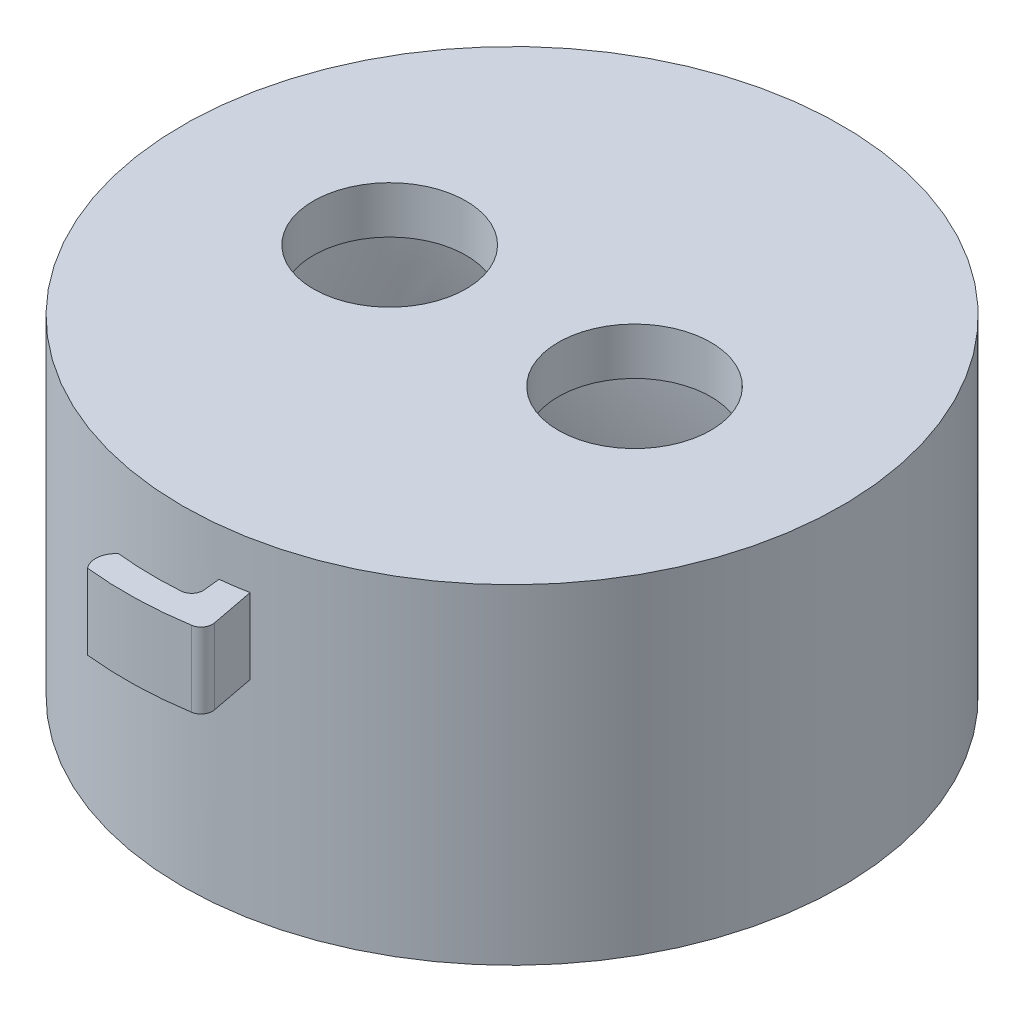
ISO-10303-21;
HEADER;
FILE_DESCRIPTION(('STEP AP214'),'2;1');
FILE_NAME('part.step','',(''),(''),'','','');
FILE_SCHEMA(('AUTOMOTIVE_DESIGN { 1 0 10303 214 1 1 1 1 }'));
ENDSEC;
DATA;
#1=APPLICATION_CONTEXT('core data for automotive mechanical design processes');
#2=APPLICATION_PROTOCOL_DEFINITION('international standard','automotive_design',2000,#1);
#3=PRODUCT_CONTEXT('',#1,'mechanical');
#4=PRODUCT('Part','Part','',(#3));
#5=PRODUCT_RELATED_PRODUCT_CATEGORY('part','',(#4));
#6=PRODUCT_DEFINITION_FORMATION('','',#4);
#7=PRODUCT_DEFINITION_CONTEXT('part definition',#1,'design');
#8=PRODUCT_DEFINITION('design','',#6,#7);
#9=PRODUCT_DEFINITION_SHAPE('','',#8);
#10=(LENGTH_UNIT() NAMED_UNIT(*) SI_UNIT(.MILLI.,.METRE.));
#11=(NAMED_UNIT(*) PLANE_ANGLE_UNIT() SI_UNIT($,.RADIAN.));
#12=(NAMED_UNIT(*) SI_UNIT($,.STERADIAN.) SOLID_ANGLE_UNIT());
#13=UNCERTAINTY_MEASURE_WITH_UNIT(LENGTH_MEASURE(1.E-05),#10,'distance_accuracy_value','');
#14=(GEOMETRIC_REPRESENTATION_CONTEXT(3) GLOBAL_UNCERTAINTY_ASSIGNED_CONTEXT((#13)) GLOBAL_UNIT_ASSIGNED_CONTEXT((#10,
#11,#12)) REPRESENTATION_CONTEXT('',''));
#15=CARTESIAN_POINT('',(0.,0.,0.));
#16=DIRECTION('',(0.,0.,1.));
#17=DIRECTION('',(1.,0.,0.));
#18=AXIS2_PLACEMENT_3D('',#15,#16,#17);
#19=CARTESIAN_POINT('',(0.,17.5,0.));
#20=DIRECTION('',(0.,-1.,0.));
#21=DIRECTION('',(0.,0.,-1.));
#22=AXIS2_PLACEMENT_3D('',#19,#20,#21);
#23=CYLINDRICAL_SURFACE('',#22,35.);
#24=CARTESIAN_POINT('',(0.,-17.5,0.));
#25=DIRECTION('',(0.,1.,0.));
#26=DIRECTION('',(0.,0.,1.));
#27=AXIS2_PLACEMENT_3D('',#24,#25,#26);
#28=CIRCLE('',#27,35.);
#29=CARTESIAN_POINT('',(0.,-17.5,35.));
#30=VERTEX_POINT('',#29);
#31=EDGE_CURVE('E46',#30,#30,#28,.T.);
#32=ORIENTED_EDGE('',*,*,#31,.T.);
#33=EDGE_LOOP('',(#32));
#34=FACE_BOUND('',#33,.T.);
#35=CARTESIAN_POINT('',(0.,17.5,0.));
#36=DIRECTION('',(0.,1.,0.));
#37=DIRECTION('',(0.,0.,1.));
#38=AXIS2_PLACEMENT_3D('',#35,#36,#37);
#39=CIRCLE('',#38,35.);
#40=CARTESIAN_POINT('',(0.,17.5,35.));
#41=VERTEX_POINT('',#40);
#42=EDGE_CURVE('E12',#41,#41,#39,.T.);
#43=ORIENTED_EDGE('',*,*,#42,.F.);
#44=EDGE_LOOP('',(#43));
#45=FACE_BOUND('',#44,.T.);
#46=CARTESIAN_POINT('',(0.,4.5,0.));
#47=DIRECTION('',(0.,1.,0.));
#48=DIRECTION('',(0.,0.,1.));
#49=AXIS2_PLACEMENT_3D('',#46,#47,#48);
#50=CIRCLE('',#49,35.);
#51=CARTESIAN_POINT('',(3.68421052631579,4.5,34.8055540510101));
#52=VERTEX_POINT('',#51);
#53=CARTESIAN_POINT('',(6.5596919127086,4.5,34.3797970036233));
#54=VERTEX_POINT('',#53);
#55=EDGE_CURVE('E114',#52,#54,#50,.T.);
#56=ORIENTED_EDGE('',*,*,#55,.F.);
#57=DIRECTION('',(0.,1.,0.));
#58=VECTOR('',#57,1.);
#59=CARTESIAN_POINT('',(3.68421052631579,4.5,34.8055540510101));
#60=LINE('',#59,#58);
#61=CARTESIAN_POINT('',(3.68421052631579,12.5,34.8055540510101));
#62=VERTEX_POINT('',#61);
#63=EDGE_CURVE('E132',#52,#62,#60,.T.);
#64=ORIENTED_EDGE('',*,*,#63,.T.);
#65=CARTESIAN_POINT('',(0.,12.5,0.));
#66=DIRECTION('',(0.,1.,0.));
#67=DIRECTION('',(0.,0.,1.));
#68=AXIS2_PLACEMENT_3D('',#65,#66,#67);
#69=CIRCLE('',#68,35.);
#70=CARTESIAN_POINT('',(6.5596919127086,12.5,34.3797970036233));
#71=VERTEX_POINT('',#70);
#72=EDGE_CURVE('E131',#62,#71,#69,.T.);
#73=ORIENTED_EDGE('',*,*,#72,.T.);
#74=DIRECTION('',(0.,1.,0.));
#75=VECTOR('',#74,1.);
#76=CARTESIAN_POINT('',(6.5596919127086,4.5,34.3797970036233));
#77=LINE('',#76,#75);
#78=EDGE_CURVE('E126',#54,#71,#77,.T.);
#79=ORIENTED_EDGE('',*,*,#78,.F.);
#80=EDGE_LOOP('',(#56,#64,#73,#79));
#81=FACE_BOUND('',#80,.T.);
#82=ADVANCED_FACE('F38',(#34,#45,#81),#23,.T.);
#83=CARTESIAN_POINT('',(0.,17.5,0.));
#84=DIRECTION('',(0.,1.,0.));
#85=DIRECTION('',(0.,0.,1.));
#86=AXIS2_PLACEMENT_3D('',#83,#84,#85);
#87=PLANE('',#86);
#88=CARTESIAN_POINT('',(-13.,17.5,0.));
#89=DIRECTION('',(0.,1.,0.));
#90=DIRECTION('',(0.,0.,1.));
#91=AXIS2_PLACEMENT_3D('',#88,#89,#90);
#92=CIRCLE('',#91,8.1);
#93=CARTESIAN_POINT('',(-13.,17.5,8.1));
#94=VERTEX_POINT('',#93);
#95=EDGE_CURVE('E201',#94,#94,#92,.T.);
#96=ORIENTED_EDGE('',*,*,#95,.F.);
#97=EDGE_LOOP('',(#96));
#98=FACE_BOUND('',#97,.T.);
#99=CARTESIAN_POINT('',(13.,17.5,0.));
#100=DIRECTION('',(0.,1.,0.));
#101=DIRECTION('',(0.,0.,1.));
#102=AXIS2_PLACEMENT_3D('',#99,#100,#101);
#103=CIRCLE('',#102,8.1);
#104=CARTESIAN_POINT('',(13.,17.5,8.1));
#105=VERTEX_POINT('',#104);
#106=EDGE_CURVE('E200',#105,#105,#103,.T.);
#107=ORIENTED_EDGE('',*,*,#106,.F.);
#108=EDGE_LOOP('',(#107));
#109=FACE_BOUND('',#108,.T.);
#110=ORIENTED_EDGE('',*,*,#42,.T.);
#111=EDGE_LOOP('',(#110));
#112=FACE_BOUND('',#111,.T.);
#113=ADVANCED_FACE('F213',(#98,#109,#112),#87,.T.);
#114=CARTESIAN_POINT('',(0.,-17.5,0.));
#115=DIRECTION('',(0.,1.,0.));
#116=DIRECTION('',(0.,0.,1.));
#117=AXIS2_PLACEMENT_3D('',#114,#115,#116);
#118=PLANE('',#117);
#119=CARTESIAN_POINT('',(0.,-17.5,0.));
#120=DIRECTION('',(0.,-1.,0.));
#121=DIRECTION('',(0.,0.,-1.));
#122=AXIS2_PLACEMENT_3D('',#119,#120,#121);
#123=CIRCLE('',#122,30.25);
#124=CARTESIAN_POINT('',(-27.910850381071,-17.5,11.6639157663912));
#125=VERTEX_POINT('',#124);
#126=EDGE_CURVE('E156',#125,#125,#123,.T.);
#127=ORIENTED_EDGE('',*,*,#126,.F.);
#128=EDGE_LOOP('',(#127));
#129=FACE_BOUND('',#128,.T.);
#130=ORIENTED_EDGE('',*,*,#31,.F.);
#131=EDGE_LOOP('',(#130));
#132=FACE_BOUND('',#131,.T.);
#133=ADVANCED_FACE('F210',(#129,#132),#118,.F.);
#134=CARTESIAN_POINT('',(13.,-17.5,0.));
#135=DIRECTION('',(0.,1.,0.));
#136=DIRECTION('',(0.,0.,1.));
#137=AXIS2_PLACEMENT_3D('',#134,#135,#136);
#138=CYLINDRICAL_SURFACE('',#137,8.1);
#139=CARTESIAN_POINT('',(13.,12.5,0.));
#140=DIRECTION('',(0.,1.,0.));
#141=DIRECTION('',(0.,0.,1.));
#142=AXIS2_PLACEMENT_3D('',#139,#140,#141);
#143=CIRCLE('',#142,8.1);
#144=CARTESIAN_POINT('',(13.,12.5,8.1));
#145=VERTEX_POINT('',#144);
#146=EDGE_CURVE('E197',#145,#145,#143,.F.);
#147=ORIENTED_EDGE('',*,*,#146,.T.);
#148=EDGE_LOOP('',(#147));
#149=FACE_BOUND('',#148,.T.);
#150=ORIENTED_EDGE('',*,*,#106,.T.);
#151=EDGE_LOOP('',(#150));
#152=FACE_BOUND('',#151,.T.);
#153=ADVANCED_FACE('F212',(#149,#152),#138,.F.);
#154=CARTESIAN_POINT('',(-13.,-17.5,0.));
#155=DIRECTION('',(0.,1.,0.));
#156=DIRECTION('',(0.,0.,1.));
#157=AXIS2_PLACEMENT_3D('',#154,#155,#156);
#158=CYLINDRICAL_SURFACE('',#157,8.1);
#159=CARTESIAN_POINT('',(-13.,12.5,0.));
#160=DIRECTION('',(0.,1.,0.));
#161=DIRECTION('',(0.,0.,1.));
#162=AXIS2_PLACEMENT_3D('',#159,#160,#161);
#163=CIRCLE('',#162,8.1);
#164=CARTESIAN_POINT('',(-13.,12.5,8.1));
#165=VERTEX_POINT('',#164);
#166=EDGE_CURVE('E41',#165,#165,#163,.F.);
#167=ORIENTED_EDGE('',*,*,#166,.T.);
#168=EDGE_LOOP('',(#167));
#169=FACE_BOUND('',#168,.T.);
#170=ORIENTED_EDGE('',*,*,#95,.T.);
#171=EDGE_LOOP('',(#170));
#172=FACE_BOUND('',#171,.T.);
#173=ADVANCED_FACE('F182',(#169,#172),#158,.F.);
#174=CARTESIAN_POINT('',(0.,12.5,0.));
#175=DIRECTION('',(0.,1.,0.));
#176=DIRECTION('',(0.,0.,1.));
#177=AXIS2_PLACEMENT_3D('',#174,#175,#176);
#178=PLANE('',#177);
#179=ORIENTED_EDGE('',*,*,#166,.F.);
#180=EDGE_LOOP('',(#179));
#181=FACE_BOUND('',#180,.T.);
#182=CARTESIAN_POINT('',(0.,12.5,0.));
#183=DIRECTION('',(0.,1.,0.));
#184=DIRECTION('',(0.,0.,1.));
#185=AXIS2_PLACEMENT_3D('',#182,#183,#184);
#186=CIRCLE('',#185,29.5);
#187=CARTESIAN_POINT('',(-29.1483123128359,12.5,-4.54157344027123));
#188=VERTEX_POINT('',#187);
#189=EDGE_CURVE('E151',#188,#188,#186,.T.);
#190=ORIENTED_EDGE('',*,*,#189,.F.);
#191=EDGE_LOOP('',(#190));
#192=FACE_BOUND('',#191,.T.);
#193=ORIENTED_EDGE('',*,*,#146,.F.);
#194=EDGE_LOOP('',(#193));
#195=FACE_BOUND('',#194,.T.);
#196=ADVANCED_FACE('F171',(#181,#192,#195),#178,.F.);
#197=CARTESIAN_POINT('',(-27.910850381071,-17.5,11.6639157663912));
#198=CARTESIAN_POINT('',(-29.1483123128359,12.5,-4.54157344027123));
#199=CARTESIAN_POINT('',(-4.58301884828858,-17.5,67.4856165285332));
#200=CARTESIAN_POINT('',(-38.2314591933784,12.5,53.7550511854007));
#201=CARTESIAN_POINT('',(51.2386819138534,-17.5,44.1577849957508));
#202=CARTESIAN_POINT('',(20.0651654322935,12.5,62.8381980659431));
#203=CARTESIAN_POINT('',(27.910850381071,-17.5,-11.6639157663912));
#204=CARTESIAN_POINT('',(29.1483123128359,12.5,4.5415734402712));
#205=CARTESIAN_POINT('',(4.58301884828856,-17.5,-67.4856165285332));
#206=CARTESIAN_POINT('',(38.2314591933783,12.5,-53.7550511854007));
#207=CARTESIAN_POINT('',(-51.2386819138535,-17.5,-44.1577849957508));
#208=CARTESIAN_POINT('',(-20.0651654322935,12.5,-62.8381980659431));
#209=CARTESIAN_POINT('',(-27.910850381071,-17.5,11.6639157663912));
#210=CARTESIAN_POINT('',(-29.1483123128359,12.5,-4.54157344027123));
#211=(BOUNDED_SURFACE() B_SPLINE_SURFACE(3,1,((#197,#198),(#199,#200),(#201,#202),(#203,#204),
(#205,#206),(#207,#208),(#209,#210)),.UNSPECIFIED.,.T.,.F.,.F.) B_SPLINE_SURFACE_WITH_KNOTS((4,
3,4),(2,2),(0.,0.5,1.),(0.,1.),
.UNSPECIFIED.) GEOMETRIC_REPRESENTATION_ITEM() RATIONAL_B_SPLINE_SURFACE(((1.,1.),
(0.333333333333333,0.333333333333333),(0.333333333333333,0.333333333333333),(1.,1.),
(0.333333333333333,0.333333333333333),(0.333333333333333,0.333333333333333),(1.,1.))) REPRESENTATION_ITEM('') SURFACE());
#212=CARTESIAN_POINT('',(-27.910850381071,-17.5,11.6639157663912));
#213=CARTESIAN_POINT('',(-27.9237406095269,-17.1875,11.4951085871551));
#214=CARTESIAN_POINT('',(-27.9366308379828,-16.875,11.3263014079191));
#215=CARTESIAN_POINT('',(-27.9624112948945,-16.25,10.9886870494469));
#216=CARTESIAN_POINT('',(-27.9753015233504,-15.9375,10.8198798702109));
#217=CARTESIAN_POINT('',(-28.0010819802622,-15.3125,10.4822655117387));
#218=CARTESIAN_POINT('',(-28.0139722087181,-15.,10.3134583325027));
#219=CARTESIAN_POINT('',(-28.0397526656298,-14.375,9.97584397403054));
#220=CARTESIAN_POINT('',(-28.0526428940857,-14.0625,9.80703679479447));
#221=CARTESIAN_POINT('',(-28.0784233509975,-13.4375,9.46942243632234));
#222=CARTESIAN_POINT('',(-28.0913135794534,-13.125,9.30061525708627));
#223=CARTESIAN_POINT('',(-28.1170940363651,-12.5,8.96300089861414));
#224=CARTESIAN_POINT('',(-28.129984264821,-12.1875,8.79419371937807));
#225=CARTESIAN_POINT('',(-28.1557647217328,-11.5625,8.45657936090593));
#226=CARTESIAN_POINT('',(-28.1686549501887,-11.25,8.28777218166987));
#227=CARTESIAN_POINT('',(-28.1944354071005,-10.625,7.95015782319773));
#228=CARTESIAN_POINT('',(-28.2073256355563,-10.3125,7.78135064396166));
#229=CARTESIAN_POINT('',(-28.2331060924681,-9.6875,7.44373628548953));
#230=CARTESIAN_POINT('',(-28.245996320924,-9.375,7.27492910625346));
#231=CARTESIAN_POINT('',(-28.2717767778358,-8.75,6.93731474778133));
#232=CARTESIAN_POINT('',(-28.2846670062917,-8.4375,6.76850756854526));
#233=CARTESIAN_POINT('',(-28.3104474632034,-7.8125,6.43089321007313));
#234=CARTESIAN_POINT('',(-28.3233376916593,-7.5,6.26208603083706));
#235=CARTESIAN_POINT('',(-28.3491181485711,-6.875,5.92447167236493));
#236=CARTESIAN_POINT('',(-28.362008377027,-6.5625,5.75566449312886));
#237=CARTESIAN_POINT('',(-28.3877888339387,-5.9375,5.41805013465673));
#238=CARTESIAN_POINT('',(-28.4006790623946,-5.625,5.24924295542066));
#239=CARTESIAN_POINT('',(-28.4264595193064,-5.,4.91162859694852));
#240=CARTESIAN_POINT('',(-28.4393497477623,-4.6875,4.74282141771246));
#241=CARTESIAN_POINT('',(-28.465130204674,-4.0625,4.40520705924032));
#242=CARTESIAN_POINT('',(-28.4780204331299,-3.75,4.23639988000426));
#243=CARTESIAN_POINT('',(-28.5038008900417,-3.125,3.89878552153212));
#244=CARTESIAN_POINT('',(-28.5166911184976,-2.8125,3.72997834229605));
#245=CARTESIAN_POINT('',(-28.5424715754093,-2.1875,3.39236398382392));
#246=CARTESIAN_POINT('',(-28.5553618038652,-1.875,3.22355680458785));
#247=CARTESIAN_POINT('',(-28.581142260777,-1.25,2.88594244611572));
#248=CARTESIAN_POINT('',(-28.5940324892329,-0.9375,2.71713526687965));
#249=CARTESIAN_POINT('',(-28.6198129461447,-0.312500000000001,2.37952090840752));
#250=CARTESIAN_POINT('',(-28.6327031746005,0.,2.21071372917145));
#251=CARTESIAN_POINT('',(-28.6584836315123,0.624999999999999,1.87309937069932));
#252=CARTESIAN_POINT('',(-28.6713738599682,0.937499999999999,1.70429219146325));
#253=CARTESIAN_POINT('',(-28.69715431688,1.5625,1.36667783299112));
#254=CARTESIAN_POINT('',(-28.7100445453359,1.875,1.19787065375505));
#255=CARTESIAN_POINT('',(-28.7358250022476,2.5,0.860256295282915));
#256=CARTESIAN_POINT('',(-28.7487152307035,2.8125,0.691449116046848));
#257=CARTESIAN_POINT('',(-28.7744956876153,3.4375,0.353834757574714));
#258=CARTESIAN_POINT('',(-28.7873859160712,3.75,0.185027578338647));
#259=CARTESIAN_POINT('',(-28.8131663729829,4.375,-0.152586780133488));
#260=CARTESIAN_POINT('',(-28.8260566014388,4.6875,-0.321393959369555));
#261=CARTESIAN_POINT('',(-28.8518370583506,5.3125,-0.659008317841689));
#262=CARTESIAN_POINT('',(-28.8647272868065,5.625,-0.827815497077756));
#263=CARTESIAN_POINT('',(-28.8905077437182,6.25,-1.16542985554989));
#264=CARTESIAN_POINT('',(-28.9033979721741,6.5625,-1.33423703478596));
#265=CARTESIAN_POINT('',(-28.9291784290859,7.1875,-1.67185139325809));
#266=CARTESIAN_POINT('',(-28.9420686575418,7.5,-1.84065857249416));
#267=CARTESIAN_POINT('',(-28.9678491144535,8.125,-2.17827293096629));
#268=CARTESIAN_POINT('',(-28.9807393429094,8.4375,-2.34708011020236));
#269=CARTESIAN_POINT('',(-29.0065197998212,9.0625,-2.68469446867449));
#270=CARTESIAN_POINT('',(-29.0194100282771,9.375,-2.85350164791056));
#271=CARTESIAN_POINT('',(-29.0451904851889,10.,-3.1911160063827));
#272=CARTESIAN_POINT('',(-29.0580807136447,10.3125,-3.35992318561876));
#273=CARTESIAN_POINT('',(-29.0838611705565,10.9375,-3.6975375440909));
#274=CARTESIAN_POINT('',(-29.0967513990124,11.25,-3.86634472332696));
#275=CARTESIAN_POINT('',(-29.1225318559242,11.875,-4.2039590817991));
#276=CARTESIAN_POINT('',(-29.13542208438,12.1875,-4.37276626103517));
#277=CARTESIAN_POINT('',(-29.1483123128359,12.5,-4.54157344027123));
#278=B_SPLINE_CURVE_WITH_KNOTS('',3,(#212,#213,#214,#215,#216,#217,#218,#219,#220,#221,#222,
#223,#224,#225,#226,#227,#228,#229,#230,#231,#232,#233,#234,#235,#236,#237,#238,#239,#240,#241,
#242,#243,#244,#245,#246,#247,#248,#249,#250,#251,#252,#253,#254,#255,#256,#257,#258,#259,#260,
#261,#262,#263,#264,#265,#266,#267,#268,#269,#270,#271,#272,#273,#274,#275,#276,#277),
.UNSPECIFIED.,.F.,.F.,(4,2,2,2,2,2,2,2,2,2,2,2,2,2,2,2,2,2,2,2,2,2,2,2,2,2,2,2,2,2,2,2,4),(0.,
1.06623845633214,2.13247691266428,3.19871536899642,4.26495382532856,5.3311922816607,
6.39743073799283,7.46366919432498,8.52990765065712,9.59614610698925,10.6623845633214,
11.7286230196535,12.7948614759857,13.8610999323178,14.9273383886499,15.9935768449821,
17.0598153013142,18.1260537576464,19.1922922139785,20.2585306703106,21.3247691266428,
22.3910075829749,23.4572460393071,24.5234844956392,25.5897229519713,26.6559614083035,
27.7221998646356,28.7884383209678,29.8546767772999,30.920915233632,31.9871536899642,
33.0533921462963,34.1196306026285),.UNSPECIFIED.);
#279=EDGE_CURVE('BSEAM158',#125,#188,#278,.T.);
#280=ORIENTED_EDGE('',*,*,#126,.T.);
#281=ORIENTED_EDGE('',*,*,#189,.T.);
#282=ORIENTED_EDGE('',*,*,#279,.T.);
#283=ORIENTED_EDGE('',*,*,#279,.F.);
#284=EDGE_LOOP('',(#280,#282,#281,#283));
#285=FACE_BOUND('',#284,.T.);
#286=ADVANCED_FACE('F158',(#285),#211,.F.);
#287=CARTESIAN_POINT('',(2.67829088443903,4.5,36.7024080672962));
#288=DIRECTION('',(0.,1.,0.));
#289=DIRECTION('',(0.,0.,1.));
#290=AXIS2_PLACEMENT_3D('',#287,#288,#289);
#291=CYLINDRICAL_SURFACE('',#290,1.2);
#292=CARTESIAN_POINT('',(2.67829088443903,12.5,36.7024080672962));
#293=DIRECTION('',(0.,1.,0.));
#294=DIRECTION('',(0.,0.,1.));
#295=AXIS2_PLACEMENT_3D('',#292,#293,#294);
#296=CIRCLE('',#295,1.2);
#297=CARTESIAN_POINT('',(2.7656264567577,12.5,37.8992257216646));
#298=VERTEX_POINT('',#297);
#299=CARTESIAN_POINT('',(3.87162416618795,12.5,36.5760922778225));
#300=VERTEX_POINT('',#299);
#301=EDGE_CURVE('E348',#298,#300,#296,.T.);
#302=ORIENTED_EDGE('',*,*,#301,.T.);
#303=DIRECTION('',(0.,1.,0.));
#304=VECTOR('',#303,1.);
#305=CARTESIAN_POINT('',(3.87162416618795,4.5,36.5760922778225));
#306=LINE('',#305,#304);
#307=CARTESIAN_POINT('',(3.87162416618795,4.5,36.5760922778225));
#308=VERTEX_POINT('',#307);
#309=EDGE_CURVE('E134',#308,#300,#306,.T.);
#310=ORIENTED_EDGE('',*,*,#309,.F.);
#311=CARTESIAN_POINT('',(2.67829088443903,4.5,36.7024080672962));
#312=DIRECTION('',(0.,1.,0.));
#313=DIRECTION('',(0.,0.,1.));
#314=AXIS2_PLACEMENT_3D('',#311,#312,#313);
#315=CIRCLE('',#314,1.2);
#316=CARTESIAN_POINT('',(2.7656264567577,4.5,37.8992257216646));
#317=VERTEX_POINT('',#316);
#318=EDGE_CURVE('E366',#317,#308,#315,.T.);
#319=ORIENTED_EDGE('',*,*,#318,.F.);
#320=DIRECTION('',(0.,1.,0.));
#321=VECTOR('',#320,1.);
#322=CARTESIAN_POINT('',(2.7656264567577,4.5,37.8992257216646));
#323=LINE('',#322,#321);
#324=EDGE_CURVE('E97',#317,#298,#323,.T.);
#325=ORIENTED_EDGE('',*,*,#324,.T.);
#326=EDGE_LOOP('',(#302,#310,#319,#325));
#327=FACE_BOUND('',#326,.T.);
#328=ADVANCED_FACE('F170',(#327),#291,.F.);
#329=CARTESIAN_POINT('',(0.,4.5,0.));
#330=DIRECTION('',(0.994444401457431,0.,-0.105263157894737));
#331=DIRECTION('',(-0.105263157894737,0.,-0.994444401457431));
#332=AXIS2_PLACEMENT_3D('',#329,#330,#331);
#333=PLANE('',#332);
#334=DIRECTION('',(-0.105263157894737,0.,-0.994444401457431));
#335=VECTOR('',#334,1.);
#336=CARTESIAN_POINT('',(0.,12.5,0.));
#337=LINE('',#336,#335);
#338=EDGE_CURVE('E90',#300,#62,#337,.T.);
#339=ORIENTED_EDGE('',*,*,#338,.T.);
#340=ORIENTED_EDGE('',*,*,#63,.F.);
#341=DIRECTION('',(-0.105263157894737,0.,-0.994444401457431));
#342=VECTOR('',#341,1.);
#343=CARTESIAN_POINT('',(0.,4.5,0.));
#344=LINE('',#343,#342);
#345=EDGE_CURVE('E63',#308,#52,#344,.T.);
#346=ORIENTED_EDGE('',*,*,#345,.F.);
#347=ORIENTED_EDGE('',*,*,#309,.T.);
#348=EDGE_LOOP('',(#339,#340,#346,#347));
#349=FACE_BOUND('',#348,.T.);
#350=ADVANCED_FACE('F268',(#349),#333,.F.);
#351=CARTESIAN_POINT('',(0.,4.5,0.));
#352=DIRECTION('',(0.982279914389237,0.,-0.187419768934532));
#353=DIRECTION('',(-0.187419768934532,0.,-0.982279914389237));
#354=AXIS2_PLACEMENT_3D('',#351,#352,#353);
#355=PLANE('',#354);
#356=DIRECTION('',(-0.187419768934532,0.,-0.982279914389237));
#357=VECTOR('',#356,1.);
#358=CARTESIAN_POINT('',(0.,12.5,0.));
#359=LINE('',#358,#357);
#360=CARTESIAN_POINT('',(7.45591552431055,12.5,39.0769666644476));
#361=VERTEX_POINT('',#360);
#362=EDGE_CURVE('E54',#361,#71,#359,.T.);
#363=ORIENTED_EDGE('',*,*,#362,.F.);
#364=DIRECTION('',(0.,1.,0.));
#365=VECTOR('',#364,1.);
#366=CARTESIAN_POINT('',(7.45591552431055,4.5,39.0769666644476));
#367=LINE('',#366,#365);
#368=CARTESIAN_POINT('',(7.45591552431055,4.5,39.0769666644476));
#369=VERTEX_POINT('',#368);
#370=EDGE_CURVE('E128',#369,#361,#367,.T.);
#371=ORIENTED_EDGE('',*,*,#370,.F.);
#372=DIRECTION('',(-0.187419768934532,0.,-0.982279914389237));
#373=VECTOR('',#372,1.);
#374=CARTESIAN_POINT('',(0.,4.5,0.));
#375=LINE('',#374,#373);
#376=EDGE_CURVE('E118',#369,#54,#375,.T.);
#377=ORIENTED_EDGE('',*,*,#376,.T.);
#378=ORIENTED_EDGE('',*,*,#78,.T.);
#379=EDGE_LOOP('',(#363,#371,#377,#378));
#380=FACE_BOUND('',#379,.T.);
#381=ADVANCED_FACE('F125',(#380),#355,.T.);
#382=CARTESIAN_POINT('',(6.27717962704346,4.5,39.301870387169));
#383=DIRECTION('',(0.,1.,0.));
#384=DIRECTION('',(0.,0.,1.));
#385=AXIS2_PLACEMENT_3D('',#382,#383,#384);
#386=CYLINDRICAL_SURFACE('',#385,1.2);
#387=CARTESIAN_POINT('',(6.27717962704346,12.5,39.301870387169));
#388=DIRECTION('',(0.,1.,0.));
#389=DIRECTION('',(0.,0.,1.));
#390=AXIS2_PLACEMENT_3D('',#387,#388,#389);
#391=CIRCLE('',#390,1.2);
#392=CARTESIAN_POINT('',(6.46644132434127,12.5,40.4868514038676));
#393=VERTEX_POINT('',#392);
#394=EDGE_CURVE('E362',#393,#361,#391,.T.);
#395=ORIENTED_EDGE('',*,*,#394,.F.);
#396=DIRECTION('',(0.,1.,0.));
#397=VECTOR('',#396,1.);
#398=CARTESIAN_POINT('',(6.46644132434127,4.5,40.4868514038676));
#399=LINE('',#398,#397);
#400=CARTESIAN_POINT('',(6.46644132434127,4.5,40.4868514038676));
#401=VERTEX_POINT('',#400);
#402=EDGE_CURVE('E136',#401,#393,#399,.T.);
#403=ORIENTED_EDGE('',*,*,#402,.F.);
#404=CARTESIAN_POINT('',(6.27717962704346,4.5,39.301870387169));
#405=DIRECTION('',(0.,1.,0.));
#406=DIRECTION('',(0.,0.,1.));
#407=AXIS2_PLACEMENT_3D('',#404,#405,#406);
#408=CIRCLE('',#407,1.2);
#409=EDGE_CURVE('E129',#401,#369,#408,.T.);
#410=ORIENTED_EDGE('',*,*,#409,.T.);
#411=ORIENTED_EDGE('',*,*,#370,.T.);
#412=EDGE_LOOP('',(#395,#403,#410,#411));
#413=FACE_BOUND('',#412,.T.);
#414=ADVANCED_FACE('F281',(#413),#386,.T.);
#415=CARTESIAN_POINT('',(0.,4.5,0.));
#416=DIRECTION('',(0.,1.,0.));
#417=DIRECTION('',(0.,0.,1.));
#418=AXIS2_PLACEMENT_3D('',#415,#416,#417);
#419=CYLINDRICAL_SURFACE('',#418,41.);
#420=CARTESIAN_POINT('',(0.,12.5,0.));
#421=DIRECTION('',(0.,1.,0.));
#422=DIRECTION('',(0.,0.,1.));
#423=AXIS2_PLACEMENT_3D('',#420,#421,#422);
#424=CIRCLE('',#423,41.);
#425=CARTESIAN_POINT('',(-4.31578947368421,12.5,40.7722204597547));
#426=VERTEX_POINT('',#425);
#427=EDGE_CURVE('E357',#393,#426,#424,.F.);
#428=ORIENTED_EDGE('',*,*,#427,.T.);
#429=DIRECTION('',(0.,1.,0.));
#430=VECTOR('',#429,1.);
#431=CARTESIAN_POINT('',(-4.31578947368421,4.5,40.7722204597547));
#432=LINE('',#431,#430);
#433=CARTESIAN_POINT('',(-4.31578947368421,4.5,40.7722204597547));
#434=VERTEX_POINT('',#433);
#435=EDGE_CURVE('E141',#434,#426,#432,.T.);
#436=ORIENTED_EDGE('',*,*,#435,.F.);
#437=CARTESIAN_POINT('',(0.,4.5,0.));
#438=DIRECTION('',(0.,1.,0.));
#439=DIRECTION('',(0.,0.,1.));
#440=AXIS2_PLACEMENT_3D('',#437,#438,#439);
#441=CIRCLE('',#440,41.);
#442=EDGE_CURVE('E374',#401,#434,#441,.F.);
#443=ORIENTED_EDGE('',*,*,#442,.F.);
#444=ORIENTED_EDGE('',*,*,#402,.T.);
#445=EDGE_LOOP('',(#428,#436,#443,#444));
#446=FACE_BOUND('',#445,.T.);
#447=ADVANCED_FACE('F288',(#446),#419,.T.);
#448=CARTESIAN_POINT('',(-2.66622813465595,4.5,39.4384485944106));
#449=DIRECTION('',(0.,1.,0.));
#450=DIRECTION('',(0.,0.,1.));
#451=AXIS2_PLACEMENT_3D('',#448,#449,#450);
#452=CYLINDRICAL_SURFACE('',#451,2.12132034355965);
#453=CARTESIAN_POINT('',(-2.66622813465595,12.5,39.4384485944106));
#454=DIRECTION('',(0.,1.,0.));
#455=DIRECTION('',(0.,0.,1.));
#456=AXIS2_PLACEMENT_3D('',#453,#454,#455);
#457=CIRCLE('',#456,2.12132034355965);
#458=CARTESIAN_POINT('',(-4.,12.5,37.7888872553824));
#459=VERTEX_POINT('',#458);
#460=EDGE_CURVE('E355',#426,#459,#457,.F.);
#461=ORIENTED_EDGE('',*,*,#460,.T.);
#462=DIRECTION('',(0.,1.,0.));
#463=VECTOR('',#462,1.);
#464=CARTESIAN_POINT('',(-4.,4.5,37.7888872553824));
#465=LINE('',#464,#463);
#466=CARTESIAN_POINT('',(-4.,4.5,37.7888872553824));
#467=VERTEX_POINT('',#466);
#468=EDGE_CURVE('E144',#467,#459,#465,.T.);
#469=ORIENTED_EDGE('',*,*,#468,.F.);
#470=CARTESIAN_POINT('',(-2.66622813465595,4.5,39.4384485944106));
#471=DIRECTION('',(0.,1.,0.));
#472=DIRECTION('',(0.,0.,1.));
#473=AXIS2_PLACEMENT_3D('',#470,#471,#472);
#474=CIRCLE('',#473,2.12132034355965);
#475=EDGE_CURVE('E372',#434,#467,#474,.F.);
#476=ORIENTED_EDGE('',*,*,#475,.F.);
#477=ORIENTED_EDGE('',*,*,#435,.T.);
#478=EDGE_LOOP('',(#461,#469,#476,#477));
#479=FACE_BOUND('',#478,.T.);
#480=ADVANCED_FACE('F296',(#479),#452,.T.);
#481=CARTESIAN_POINT('',(0.,4.5,0.));
#482=DIRECTION('',(0.,1.,0.));
#483=DIRECTION('',(0.,0.,1.));
#484=AXIS2_PLACEMENT_3D('',#481,#482,#483);
#485=CYLINDRICAL_SURFACE('',#484,38.);
#486=CARTESIAN_POINT('',(0.,12.5,0.));
#487=DIRECTION('',(0.,1.,0.));
#488=DIRECTION('',(0.,0.,1.));
#489=AXIS2_PLACEMENT_3D('',#486,#487,#488);
#490=CIRCLE('',#489,38.);
#491=EDGE_CURVE('E350',#298,#459,#490,.F.);
#492=ORIENTED_EDGE('',*,*,#491,.F.);
#493=ORIENTED_EDGE('',*,*,#324,.F.);
#494=CARTESIAN_POINT('',(0.,4.5,0.));
#495=DIRECTION('',(0.,1.,0.));
#496=DIRECTION('',(0.,0.,1.));
#497=AXIS2_PLACEMENT_3D('',#494,#495,#496);
#498=CIRCLE('',#497,38.);
#499=EDGE_CURVE('E369',#317,#467,#498,.F.);
#500=ORIENTED_EDGE('',*,*,#499,.T.);
#501=ORIENTED_EDGE('',*,*,#468,.T.);
#502=EDGE_LOOP('',(#492,#493,#500,#501));
#503=FACE_BOUND('',#502,.T.);
#504=ADVANCED_FACE('F304',(#503),#485,.F.);
#505=CARTESIAN_POINT('',(0.,4.5,0.));
#506=DIRECTION('',(0.,1.,0.));
#507=DIRECTION('',(0.,0.,1.));
#508=AXIS2_PLACEMENT_3D('',#505,#506,#507);
#509=PLANE('',#508);
#510=ORIENTED_EDGE('',*,*,#318,.T.);
#511=ORIENTED_EDGE('',*,*,#345,.T.);
#512=ORIENTED_EDGE('',*,*,#55,.T.);
#513=ORIENTED_EDGE('',*,*,#376,.F.);
#514=ORIENTED_EDGE('',*,*,#409,.F.);
#515=ORIENTED_EDGE('',*,*,#442,.T.);
#516=ORIENTED_EDGE('',*,*,#475,.T.);
#517=ORIENTED_EDGE('',*,*,#499,.F.);
#518=EDGE_LOOP('',(#510,#511,#512,#513,#514,#515,#516,#517));
#519=FACE_BOUND('',#518,.T.);
#520=ADVANCED_FACE('F116',(#519),#509,.F.);
#521=CARTESIAN_POINT('',(0.,12.5,0.));
#522=DIRECTION('',(0.,1.,0.));
#523=DIRECTION('',(0.,0.,1.));
#524=AXIS2_PLACEMENT_3D('',#521,#522,#523);
#525=PLANE('',#524);
#526=ORIENTED_EDGE('',*,*,#301,.F.);
#527=ORIENTED_EDGE('',*,*,#491,.T.);
#528=ORIENTED_EDGE('',*,*,#460,.F.);
#529=ORIENTED_EDGE('',*,*,#427,.F.);
#530=ORIENTED_EDGE('',*,*,#394,.T.);
#531=ORIENTED_EDGE('',*,*,#362,.T.);
#532=ORIENTED_EDGE('',*,*,#72,.F.);
#533=ORIENTED_EDGE('',*,*,#338,.F.);
#534=EDGE_LOOP('',(#526,#527,#528,#529,#530,#531,#532,#533));
#535=FACE_BOUND('',#534,.T.);
#536=ADVANCED_FACE('F317',(#535),#525,.T.);
#537=CLOSED_SHELL('',(#82,#113,#133,#153,#173,#196,#286,#328,#350,#381,#414,#447,#480,#504,#520,#536));
#538=MANIFOLD_SOLID_BREP('B2',#537);
#539=ADVANCED_BREP_SHAPE_REPRESENTATION('',(#18,#538),#14);
#540=SHAPE_DEFINITION_REPRESENTATION(#9,#539);
ENDSEC;
END-ISO-10303-21;
